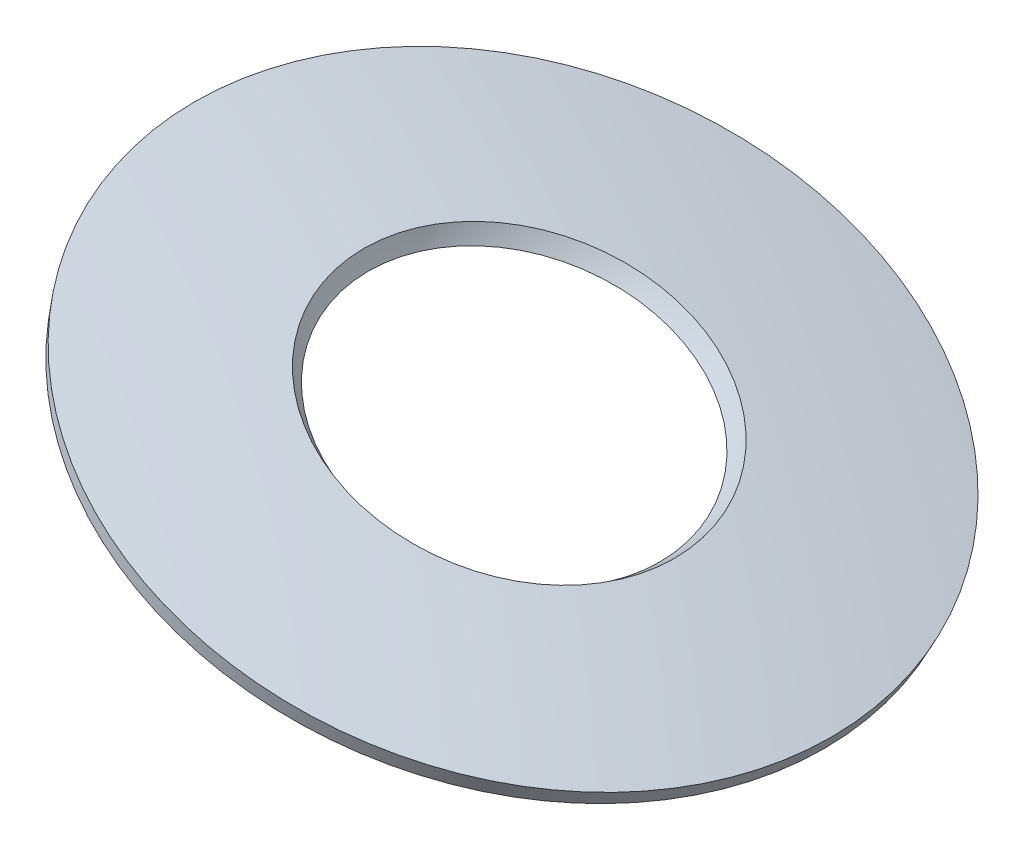
ISO-10303-21;
HEADER;
FILE_DESCRIPTION(('STEP AP214'),'2;1');
FILE_NAME('part.step','',(''),(''),'','','');
FILE_SCHEMA(('AUTOMOTIVE_DESIGN { 1 0 10303 214 1 1 1 1 }'));
ENDSEC;
DATA;
#1=APPLICATION_CONTEXT('core data for automotive mechanical design processes');
#2=APPLICATION_PROTOCOL_DEFINITION('international standard','automotive_design',2000,#1);
#3=PRODUCT_CONTEXT('',#1,'mechanical');
#4=PRODUCT('Part','Part','',(#3));
#5=PRODUCT_RELATED_PRODUCT_CATEGORY('part','',(#4));
#6=PRODUCT_DEFINITION_FORMATION('','',#4);
#7=PRODUCT_DEFINITION_CONTEXT('part definition',#1,'design');
#8=PRODUCT_DEFINITION('design','',#6,#7);
#9=PRODUCT_DEFINITION_SHAPE('','',#8);
#10=(LENGTH_UNIT() NAMED_UNIT(*) SI_UNIT(.MILLI.,.METRE.));
#11=(NAMED_UNIT(*) PLANE_ANGLE_UNIT() SI_UNIT($,.RADIAN.));
#12=(NAMED_UNIT(*) SI_UNIT($,.STERADIAN.) SOLID_ANGLE_UNIT());
#13=UNCERTAINTY_MEASURE_WITH_UNIT(LENGTH_MEASURE(1.E-05),#10,'distance_accuracy_value','');
#14=(GEOMETRIC_REPRESENTATION_CONTEXT(3) GLOBAL_UNCERTAINTY_ASSIGNED_CONTEXT((#13)) GLOBAL_UNIT_ASSIGNED_CONTEXT((#10,
#11,#12)) REPRESENTATION_CONTEXT('',''));
#15=CARTESIAN_POINT('',(0.,0.,0.));
#16=DIRECTION('',(0.,0.,1.));
#17=DIRECTION('',(1.,0.,0.));
#18=AXIS2_PLACEMENT_3D('',#15,#16,#17);
#19=CARTESIAN_POINT('',(84.1352337429095,231.159654889177,0.));
#20=DIRECTION('',(0.342020143325673,0.939692620785907,0.));
#21=DIRECTION('',(-0.939692620785907,0.342020143325673,0.));
#22=AXIS2_PLACEMENT_3D('',#19,#20,#21);
#23=CONICAL_SURFACE('',#22,34.5723379422413,0.139626340159548);
#24=CARTESIAN_POINT('',(84.6729067004574,232.636899199091,0.));
#25=DIRECTION('',(-0.342020143325673,-0.939692620785907,0.));
#26=DIRECTION('',(0.939692620785907,-0.342020143325673,0.));
#27=AXIS2_PLACEMENT_3D('',#24,#25,#26);
#28=CIRCLE('',#27,34.7932752400154);
#29=CARTESIAN_POINT('',(117.367890696473,220.736898214732,0.));
#30=VERTEX_POINT('',#29);
#31=EDGE_CURVE('E10',#30,#30,#28,.T.);
#32=ORIENTED_EDGE('',*,*,#31,.T.);
#33=EDGE_LOOP('',(#32));
#34=FACE_BOUND('',#33,.T.);
#35=CARTESIAN_POINT('',(84.1352337429095,231.159654889177,0.));
#36=DIRECTION('',(-0.342020143325673,-0.939692620785907,0.));
#37=DIRECTION('',(0.939692620785907,-0.342020143325673,0.));
#38=AXIS2_PLACEMENT_3D('',#35,#36,#37);
#39=CIRCLE('',#38,34.5723379422413);
#40=CARTESIAN_POINT('',(116.62260459055,219.335218911068,0.));
#41=VERTEX_POINT('',#40);
#42=EDGE_CURVE('E45',#41,#41,#39,.T.);
#43=ORIENTED_EDGE('',*,*,#42,.F.);
#44=EDGE_LOOP('',(#43));
#45=FACE_BOUND('',#44,.T.);
#46=ADVANCED_FACE('F31',(#34,#45),#23,.T.);
#47=CARTESIAN_POINT('',(0.,0.,0.));
#48=DIRECTION('',(-0.342020143325673,-0.939692620785907,0.));
#49=DIRECTION('',(0.939692620785907,-0.342020143325673,0.));
#50=AXIS2_PLACEMENT_3D('',#47,#48,#49);
#51=SPHERICAL_SURFACE('',#50,250.);
#52=CARTESIAN_POINT('',(85.3077165179612,234.381024838331,0.));
#53=DIRECTION('',(-0.342020143325673,-0.939692620785907,0.));
#54=DIRECTION('',(0.939692620785907,-0.342020143325673,0.));
#55=AXIS2_PLACEMENT_3D('',#52,#53,#54);
#56=CIRCLE('',#55,16.9743541327737);
#57=CARTESIAN_POINT('',(101.258391839135,228.575453804979,0.));
#58=VERTEX_POINT('',#57);
#59=EDGE_CURVE('E37',#58,#58,#56,.T.);
#60=CARTESIAN_POINT('',(101.258391839135,228.575453804979,0.));
#61=CARTESIAN_POINT('',(101.429053527007,228.499851076512,0.));
#62=CARTESIAN_POINT('',(101.599630543483,228.424057215221,0.));
#63=CARTESIAN_POINT('',(101.94061437851,228.27208760877,0.));
#64=CARTESIAN_POINT('',(102.111021197061,228.195911863609,0.));
#65=CARTESIAN_POINT('',(102.451663781104,228.043178871198,0.));
#66=CARTESIAN_POINT('',(102.621899546596,227.966621623948,0.));
#67=CARTESIAN_POINT('',(102.962199170476,227.813126011562,0.));
#68=CARTESIAN_POINT('',(103.132263028864,227.736187646427,0.));
#69=CARTESIAN_POINT('',(103.472217985289,227.581930184253,0.));
#70=CARTESIAN_POINT('',(103.642109083327,227.504611087214,0.));
#71=CARTESIAN_POINT('',(103.98171766669,227.349592549159,0.));
#72=CARTESIAN_POINT('',(104.151435152016,227.271893108144,0.));
#73=CARTESIAN_POINT('',(104.49069565846,227.116114271963,0.));
#74=CARTESIAN_POINT('',(104.660238679578,227.038034876798,0.));
#75=CARTESIAN_POINT('',(104.999149406989,226.881496524051,0.));
#76=CARTESIAN_POINT('',(105.168517113281,226.80303756647,0.));
#77=CARTESIAN_POINT('',(105.5070763613,226.645740482532,0.));
#78=CARTESIAN_POINT('',(105.676267903026,226.566902356174,0.));
#79=CARTESIAN_POINT('',(106.014473973057,226.408847330223,0.));
#80=CARTESIAN_POINT('',(106.183488501362,226.329630430629,0.));
#81=CARTESIAN_POINT('',(106.521339696583,226.170818255648,0.));
#82=CARTESIAN_POINT('',(106.690176363499,226.09122298026,0.));
#83=CARTESIAN_POINT('',(107.027670988867,225.93165445303,0.));
#84=CARTESIAN_POINT('',(107.196328947318,225.851681201187,0.));
#85=CARTESIAN_POINT('',(107.533465309579,225.691357122283,0.));
#86=CARTESIAN_POINT('',(107.701943713387,225.611006295222,0.));
#87=CARTESIAN_POINT('',(108.038720121084,225.449927469011,0.));
#88=CARTESIAN_POINT('',(108.207018124972,225.369199469862,0.));
#89=CARTESIAN_POINT('',(108.543432888455,225.207366704497,0.));
#90=CARTESIAN_POINT('',(108.711549648049,225.126261938282,0.));
#91=CARTESIAN_POINT('',(109.047601079481,224.9636760457,0.));
#92=CARTESIAN_POINT('',(109.215535751319,224.882194919332,0.));
#93=CARTESIAN_POINT('',(109.551222164688,224.718856715246,0.));
#94=CARTESIAN_POINT('',(109.718973906219,224.636999637528,0.));
#95=CARTESIAN_POINT('',(110.054293617343,224.472909941427,0.));
#96=CARTESIAN_POINT('',(110.221861586935,224.390677323045,0.));
#97=CARTESIAN_POINT('',(110.556812913472,224.225836958188,0.));
#98=CARTESIAN_POINT('',(110.724196270416,224.143229211714,0.));
#99=CARTESIAN_POINT('',(111.058777531871,223.977639005126,0.));
#100=CARTESIAN_POINT('',(111.225975436382,223.894656545014,0.));
#101=CARTESIAN_POINT('',(111.560184954119,223.728317327483,0.));
#102=CARTESIAN_POINT('',(111.727196567345,223.644960570066,0.));
#103=CARTESIAN_POINT('',(112.061032664591,223.477873176137,0.));
#104=CARTESIAN_POINT('',(112.227857148612,223.394142539627,0.));
#105=CARTESIAN_POINT('',(112.561318150469,223.226307807599,0.));
#106=CARTESIAN_POINT('',(112.727954668306,223.142203712083,0.));
#107=CARTESIAN_POINT('',(113.061038901758,222.973622484005,0.));
#108=CARTESIAN_POINT('',(113.227486617373,222.889145351443,0.));
#109=CARTESIAN_POINT('',(113.560192411293,222.719818473108,0.));
#110=CARTESIAN_POINT('',(113.726450489598,222.634968727335,0.));
#111=CARTESIAN_POINT('',(114.058776174758,222.464897048278,0.));
#112=CARTESIAN_POINT('',(114.224843781614,222.379675114994,0.));
#113=CARTESIAN_POINT('',(114.556787690693,222.208859488486,0.));
#114=CARTESIAN_POINT('',(114.722663992917,222.123265795261,0.));
#115=CARTESIAN_POINT('',(115.054224460512,221.951707078307,0.));
#116=CARTESIAN_POINT('',(115.219908625883,221.865742054578,0.));
#117=CARTESIAN_POINT('',(115.551083988508,221.693441107905,0.));
#118=CARTESIAN_POINT('',(115.716575185763,221.607105184961,0.));
#119=CARTESIAN_POINT('',(116.04736378188,221.434062873045,0.));
#120=CARTESIAN_POINT('',(116.212661180743,221.347356484074,0.));
#121=CARTESIAN_POINT('',(116.543061350704,221.173573675014,0.));
#122=CARTESIAN_POINT('',(116.708164121801,221.086497254926,0.));
#123=CARTESIAN_POINT('',(117.038174208096,220.9119748209,0.));
#124=CARTESIAN_POINT('',(117.203081523293,220.824528806962,0.));
#125=CARTESIAN_POINT('',(117.367890696473,220.736898214732,0.));
#126=B_SPLINE_CURVE_WITH_KNOTS('',3,(#60,#61,#62,#63,#64,#65,#66,#67,#68,#69,#70,#71,#72,#73,
#74,#75,#76,#77,#78,#79,#80,#81,#82,#83,#84,#85,#86,#87,#88,#89,#90,#91,#92,#93,#94,#95,#96,#97,
#98,#99,#100,#101,#102,#103,#104,#105,#106,#107,#108,#109,#110,#111,#112,#113,#114,#115,#116,
#117,#118,#119,#120,#121,#122,#123,#124,#125),.UNSPECIFIED.,.F.,.F.,(4,2,2,2,2,2,2,2,2,2,2,2,2,
2,2,2,2,2,2,2,2,2,2,2,2,2,2,2,2,2,2,2,4),(0.,0.559973684404664,1.11994736880925,
1.67992105321391,2.23989473761852,2.79986842202317,3.35984210642776,3.91981579083243,
4.47978947523703,5.03976315964169,5.59973684404635,6.15971052845096,6.7196842128556,
7.2796578972602,7.83963158166486,8.39960526606946,8.95957895047411,9.51955263487879,
10.0795263192834,10.639500003688,11.1994736880926,11.7594473724973,12.3194210569019,
12.8793947413066,13.4393684257112,13.9993421101158,14.5593157945205,15.1192894789251,
15.6792631633297,16.2392368477343,16.799210532139,17.3591842165436,17.9191579009483),.UNSPECIFIED.);
#127=EDGE_CURVE('BSEAM54',#58,#30,#126,.T.);
#128=ORIENTED_EDGE('',*,*,#59,.T.);
#129=ORIENTED_EDGE('',*,*,#31,.F.);
#130=ORIENTED_EDGE('',*,*,#127,.T.);
#131=ORIENTED_EDGE('',*,*,#127,.F.);
#132=EDGE_LOOP('',(#128,#130,#129,#131));
#133=FACE_BOUND('',#132,.T.);
#134=ADVANCED_FACE('F54',(#133),#51,.T.);
#135=CARTESIAN_POINT('',(88.925237264675,244.320081404336,0.));
#136=DIRECTION('',(-0.342020143325673,-0.939692620785907,0.));
#137=DIRECTION('',(0.939692620785907,-0.342020143325673,0.));
#138=AXIS2_PLACEMENT_3D('',#135,#136,#137);
#139=SPHERICAL_SURFACE('',#138,19.999999999999);
#140=CARTESIAN_POINT('',(84.7873000861094,232.951192443105,0.));
#141=DIRECTION('',(-0.342020143325673,-0.939692620785907,0.));
#142=DIRECTION('',(0.939692620785907,-0.342020143325673,0.));
#143=AXIS2_PLACEMENT_3D('',#140,#141,#142);
#144=CIRCLE('',#143,15.9256346716046);
#145=CARTESIAN_POINT('',(99.7525014683484,227.504304590171,0.));
#146=VERTEX_POINT('',#145);
#147=EDGE_CURVE('E41',#146,#146,#144,.T.);
#148=CARTESIAN_POINT('',(101.258391839135,228.575453804979,0.));
#149=CARTESIAN_POINT('',(101.243232322384,228.563578982037,0.));
#150=CARTESIAN_POINT('',(101.228055655247,228.551726053449,0.));
#151=CARTESIAN_POINT('',(101.19766814705,228.528064083589,0.));
#152=CARTESIAN_POINT('',(101.182457305991,228.516255042317,0.));
#153=CARTESIAN_POINT('',(101.152001576802,228.492680945692,0.));
#154=CARTESIAN_POINT('',(101.136756688672,228.480915890341,0.));
#155=CARTESIAN_POINT('',(101.106232992555,228.4574298637,0.));
#156=CARTESIAN_POINT('',(101.090954184566,228.44570889241,0.));
#157=CARTESIAN_POINT('',(101.060362776206,228.422311131693,0.));
#158=CARTESIAN_POINT('',(101.045050175834,228.410634342265,0.));
#159=CARTESIAN_POINT('',(101.014391310467,228.387325042694,0.));
#160=CARTESIAN_POINT('',(100.999045045472,228.375692532551,0.));
#161=CARTESIAN_POINT('',(100.968318978901,228.352471888607,0.));
#162=CARTESIAN_POINT('',(100.952939177325,228.340883754806,0.));
#163=CARTESIAN_POINT('',(100.922146165914,228.31775196023,0.));
#164=CARTESIAN_POINT('',(100.906732956078,228.306208299455,0.));
#165=CARTESIAN_POINT('',(100.875873256748,228.283165547248,0.));
#166=CARTESIAN_POINT('',(100.860426767252,228.271666455815,0.));
#167=CARTESIAN_POINT('',(100.82950063748,228.248712938234,0.));
#168=CARTESIAN_POINT('',(100.814020997203,228.237258512085,0.));
#169=CARTESIAN_POINT('',(100.783028695021,228.214394420641,0.));
#170=CARTESIAN_POINT('',(100.767516033116,228.202984755347,0.));
#171=CARTESIAN_POINT('',(100.736457817109,228.180210280808,0.));
#172=CARTESIAN_POINT('',(100.720912263006,228.168845471564,0.));
#173=CARTESIAN_POINT('',(100.689788392308,228.146160803948,0.));
#174=CARTESIAN_POINT('',(100.674210075712,228.134840945577,0.));
#175=CARTESIAN_POINT('',(100.643020810004,228.112246274154,0.));
#176=CARTESIAN_POINT('',(100.627409860892,228.100971461103,0.));
#177=CARTESIAN_POINT('',(100.596155460403,228.078466974392,0.));
#178=CARTESIAN_POINT('',(100.580512009025,228.067237300732,0.));
#179=CARTESIAN_POINT('',(100.549192734525,228.044823186499,0.));
#180=CARTESIAN_POINT('',(100.533516911403,228.033638745925,0.));
#181=CARTESIAN_POINT('',(100.502133024204,228.011315191182,0.));
#182=CARTESIAN_POINT('',(100.486424960128,228.000176077012,0.));
#183=CARTESIAN_POINT('',(100.454976722083,227.977943268014,0.));
#184=CARTESIAN_POINT('',(100.439236548114,227.966849573187,0.));
#185=CARTESIAN_POINT('',(100.40772422161,227.944707695435,0.));
#186=CARTESIAN_POINT('',(100.391952069075,227.933659512511,0.));
#187=CARTESIAN_POINT('',(100.360375917035,227.911608750745,0.));
#188=CARTESIAN_POINT('',(100.34457191753,227.900606171904,0.));
#189=CARTESIAN_POINT('',(100.31293220341,227.878646710106,0.));
#190=CARTESIAN_POINT('',(100.297096488795,227.867689827148,0.));
#191=CARTESIAN_POINT('',(100.265393476581,227.845821848535,0.));
#192=CARTESIAN_POINT('',(100.249526178982,227.834910752879,0.));
#193=CARTESIAN_POINT('',(100.217760133187,227.813134439907,0.));
#194=CARTESIAN_POINT('',(100.201861384992,227.802269222591,0.));
#195=CARTESIAN_POINT('',(100.170032570657,227.78058475695,0.));
#196=CARTESIAN_POINT('',(100.154102504518,227.769765508626,0.));
#197=CARTESIAN_POINT('',(100.122211187206,227.748173071241,0.));
#198=CARTESIAN_POINT('',(100.106249936034,227.73739988218,0.));
#199=CARTESIAN_POINT('',(100.074296381831,227.715899653208,0.));
#200=CARTESIAN_POINT('',(100.0583040788,227.705172613296,0.));
#201=CARTESIAN_POINT('',(100.02628855431,227.683764772123,0.));
#202=CARTESIAN_POINT('',(100.010265332851,227.673083970862,0.));
#203=CARTESIAN_POINT('',(99.9781881051948,227.651768696104,0.));
#204=CARTESIAN_POINT('',(99.962134098998,227.641134222608,0.));
#205=CARTESIAN_POINT('',(99.9299954358121,227.619911692111,0.));
#206=CARTESIAN_POINT('',(99.913910778823,227.60932363511,0.));
#207=CARTESIAN_POINT('',(99.8817109482587,227.58819402594,0.));
#208=CARTESIAN_POINT('',(99.8655957746835,227.57765247377,0.));
#209=CARTESIAN_POINT('',(99.8333350453895,227.556615962236,0.));
#210=CARTESIAN_POINT('',(99.8171894896708,227.546121002873,0.));
#211=CARTESIAN_POINT('',(99.7848681308535,227.525177764435,0.));
#212=CARTESIAN_POINT('',(99.768692327755,227.51472948536,0.));
#213=CARTESIAN_POINT('',(99.7525014683484,227.504304590171,0.));
#214=B_SPLINE_CURVE_WITH_KNOTS('',3,(#148,#149,#150,#151,#152,#153,#154,#155,#156,#157,#158,
#159,#160,#161,#162,#163,#164,#165,#166,#167,#168,#169,#170,#171,#172,#173,#174,#175,#176,#177,
#178,#179,#180,#181,#182,#183,#184,#185,#186,#187,#188,#189,#190,#191,#192,#193,#194,#195,#196,
#197,#198,#199,#200,#201,#202,#203,#204,#205,#206,#207,#208,#209,#210,#211,#212,#213),
.UNSPECIFIED.,.F.,.F.,(4,2,2,2,2,2,2,2,2,2,2,2,2,2,2,2,2,2,2,2,2,2,2,2,2,2,2,2,2,2,2,2,4),(0.,
0.0577702258235594,0.115540451647139,0.173310677470708,0.231080903294273,0.288851129117839,
0.346621354941423,0.404391580764986,0.46216180658856,0.519932032412122,0.577702258235691,
0.635472484059264,0.69324270988283,0.7510129357064,0.808783161529977,0.866553387353553,
0.924323613177111,0.982093839000688,1.03986406482426,1.09763429064782,1.1554045164714,
1.21317474229497,1.27094496811852,1.32871519394211,1.38648541976566,1.44425564558925,
1.50202587141282,1.55979609723639,1.61756632305995,1.67533654888353,1.7331067747071,
1.79087700053067,1.84864722635423),.UNSPECIFIED.);
#215=EDGE_CURVE('BSEAM58',#58,#146,#214,.T.);
#216=ORIENTED_EDGE('',*,*,#59,.F.);
#217=ORIENTED_EDGE('',*,*,#147,.T.);
#218=ORIENTED_EDGE('',*,*,#215,.T.);
#219=ORIENTED_EDGE('',*,*,#215,.F.);
#220=EDGE_LOOP('',(#216,#218,#217,#219));
#221=FACE_BOUND('',#220,.T.);
#222=ADVANCED_FACE('F58',(#221),#139,.F.);
#223=CARTESIAN_POINT('',(0.,0.,0.));
#224=DIRECTION('',(-0.342020143325673,-0.939692620785907,0.));
#225=DIRECTION('',(0.939692620785907,-0.342020143325673,0.));
#226=AXIS2_PLACEMENT_3D('',#223,#224,#225);
#227=SPHERICAL_SURFACE('',#226,248.4125);
#228=CARTESIAN_POINT('',(99.7525014683484,227.504304590171,0.));
#229=CARTESIAN_POINT('',(99.931359447848,227.425881763049,0.));
#230=CARTESIAN_POINT('',(100.110124945996,227.347248014848,0.));
#231=CARTESIAN_POINT('',(100.467469985998,227.18955911555,0.));
#232=CARTESIAN_POINT('',(100.646049527853,227.110503964452,0.));
#233=CARTESIAN_POINT('',(101.003021661679,226.951972698616,0.));
#234=CARTESIAN_POINT('',(101.181414253651,226.872496583879,0.));
#235=CARTESIAN_POINT('',(101.53801149544,226.713123832993,0.));
#236=CARTESIAN_POINT('',(101.716216145257,226.633227196845,0.));
#237=CARTESIAN_POINT('',(102.072436511435,226.473013847538,0.));
#238=CARTESIAN_POINT('',(102.250452227795,226.392697134378,0.));
#239=CARTESIAN_POINT('',(102.606293736831,226.231644077829,0.));
#240=CARTESIAN_POINT('',(102.784119529505,226.15090773444,0.));
#241=CARTESIAN_POINT('',(103.139580201988,225.989015866534,0.));
#242=CARTESIAN_POINT('',(103.317215081797,225.907860342017,0.));
#243=CARTESIAN_POINT('',(103.672292940433,225.745130563296,0.));
#244=CARTESIAN_POINT('',(103.84973591926,225.663556309092,0.));
#245=CARTESIAN_POINT('',(104.204428988885,225.499989524761,0.));
#246=CARTESIAN_POINT('',(104.381679079682,225.417996994634,0.));
#247=CARTESIAN_POINT('',(104.735985387271,225.253594114553,0.));
#248=CARTESIAN_POINT('',(104.913041604063,225.171183764599,0.));
#249=CARTESIAN_POINT('',(105.266959178743,225.00594570328,0.));
#250=CARTESIAN_POINT('',(105.443820536632,224.923117991915,0.));
#251=CARTESIAN_POINT('',(105.797347409694,224.757045668516,0.));
#252=CARTESIAN_POINT('',(105.974012924867,224.67380105648,0.));
#253=CARTESIAN_POINT('',(106.327147129772,224.506895394797,0.));
#254=CARTESIAN_POINT('',(106.503615819505,224.42323434515,0.));
#255=CARTESIAN_POINT('',(106.856355391902,224.255496273617,0.));
#256=CARTESIAN_POINT('',(107.032626274566,224.171419251732,0.));
#257=CARTESIAN_POINT('',(107.384969252296,224.002849703413,0.));
#258=CARTESIAN_POINT('',(107.561041347363,223.91835717698,0.));
#259=CARTESIAN_POINT('',(107.912985770475,223.748957089565,0.));
#260=CARTESIAN_POINT('',(108.088858098521,223.664049528583,0.));
#261=CARTESIAN_POINT('',(108.440402009281,223.49381984438,0.));
#262=CARTESIAN_POINT('',(108.616073591995,223.408497721159,0.));
#263=CARTESIAN_POINT('',(108.967215034896,223.237439387092,0.));
#264=CARTESIAN_POINT('',(109.142684895082,223.151703176246,0.));
#265=CARTESIAN_POINT('',(109.493421916856,222.979817143848,0.));
#266=CARTESIAN_POINT('',(109.668689078443,222.893667322296,0.));
#267=CARTESIAN_POINT('',(110.019019728072,222.720954547705,0.));
#268=CARTESIAN_POINT('',(110.194083216113,222.634391594666,0.));
#269=CARTESIAN_POINT('',(110.544005544839,222.460853038617,0.));
#270=CARTESIAN_POINT('',(110.718864385523,222.373877435608,0.));
#271=CARTESIAN_POINT('',(111.06837644686,222.199514063432,0.));
#272=CARTESIAN_POINT('',(111.243029667512,222.112126294265,0.));
#273=CARTESIAN_POINT('',(111.592129517255,221.93693907588,0.));
#274=CARTESIAN_POINT('',(111.766576146345,221.849139626661,0.));
#275=CARTESIAN_POINT('',(112.115261842584,221.673129536567,0.));
#276=CARTESIAN_POINT('',(112.289500909731,221.584918895691,0.));
#277=CARTESIAN_POINT('',(112.637770512858,221.408086912966,0.));
#278=CARTESIAN_POINT('',(112.811801048836,221.319465571116,0.));
#279=CARTESIAN_POINT('',(113.159652621557,221.14181267941,0.));
#280=CARTESIAN_POINT('',(113.3334736583,221.052781129553,0.));
#281=CARTESIAN_POINT('',(113.680905265648,220.874308317082,0.));
#282=CARTESIAN_POINT('',(113.854515836254,220.784867054467,0.));
#283=CARTESIAN_POINT('',(114.201525545599,220.605575314009,0.));
#284=CARTESIAN_POINT('',(114.374924684339,220.515724836166,0.));
#285=CARTESIAN_POINT('',(114.721510565392,220.335615165048,0.));
#286=CARTESIAN_POINT('',(114.894697307707,220.245355971772,0.));
#287=CARTESIAN_POINT('',(115.240857432555,220.064429371901,0.));
#288=CARTESIAN_POINT('',(115.41383081509,219.973761965305,0.));
#289=CARTESIAN_POINT('',(115.759563258125,219.792019443014,0.));
#290=CARTESIAN_POINT('',(115.932322318626,219.700944327319,0.));
#291=CARTESIAN_POINT('',(116.277625156854,219.518386893923,0.));
#292=CARTESIAN_POINT('',(116.450168934581,219.426904576223,0.));
#293=CARTESIAN_POINT('',(116.62260459055,219.335218911068,0.));
#294=B_SPLINE_CURVE_WITH_KNOTS('',3,(#228,#229,#230,#231,#232,#233,#234,#235,#236,#237,#238,
#239,#240,#241,#242,#243,#244,#245,#246,#247,#248,#249,#250,#251,#252,#253,#254,#255,#256,#257,
#258,#259,#260,#261,#262,#263,#264,#265,#266,#267,#268,#269,#270,#271,#272,#273,#274,#275,#276,
#277,#278,#279,#280,#281,#282,#283,#284,#285,#286,#287,#288,#289,#290,#291,#292,#293),
.UNSPECIFIED.,.F.,.F.,(4,2,2,2,2,2,2,2,2,2,2,2,2,2,2,2,2,2,2,2,2,2,2,2,2,2,2,2,2,2,2,2,4),(0.,
0.585886243801906,1.1717724876038,1.75765873140576,2.34354497520767,2.92943121900957,
3.51531746281152,4.10120370661345,4.68708995041535,5.27297619421727,5.85886243801916,
6.44474868182114,7.03063492562304,7.61652116942493,8.20240741322688,8.7882936570288,
9.37417990083072,9.96006614463261,10.5459523884345,11.1318386322365,11.7177248760384,
12.3036111198403,12.8894973636423,13.4753836074442,14.0612698512461,14.647156095048,
15.2330423388499,15.8189285826519,16.4048148264538,16.9907010702557,17.5765873140576,
18.1624735578595,18.7483598016615),.UNSPECIFIED.);
#295=EDGE_CURVE('BSEAM51',#146,#41,#294,.T.);
#296=ORIENTED_EDGE('',*,*,#147,.F.);
#297=ORIENTED_EDGE('',*,*,#42,.T.);
#298=ORIENTED_EDGE('',*,*,#295,.T.);
#299=ORIENTED_EDGE('',*,*,#295,.F.);
#300=EDGE_LOOP('',(#296,#298,#297,#299));
#301=FACE_BOUND('',#300,.T.);
#302=ADVANCED_FACE('F51',(#301),#227,.F.);
#303=CLOSED_SHELL('',(#46,#134,#222,#302));
#304=MANIFOLD_SOLID_BREP('B2',#303);
#305=ADVANCED_BREP_SHAPE_REPRESENTATION('',(#18,#304),#14);
#306=SHAPE_DEFINITION_REPRESENTATION(#9,#305);
ENDSEC;
END-ISO-10303-21;
